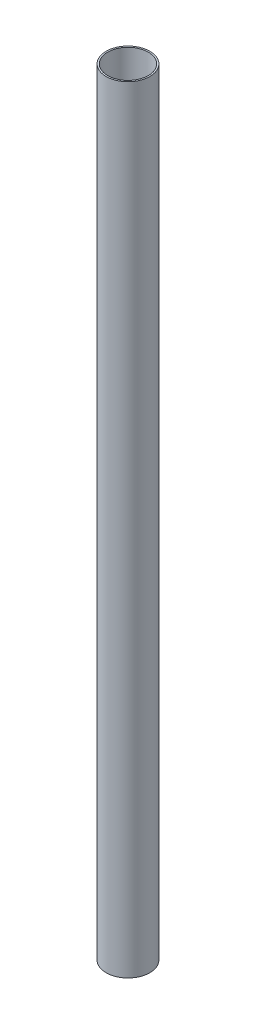
ISO-10303-21;
HEADER;
FILE_DESCRIPTION(('STEP AP214'),'2;1');
FILE_NAME('part.step','',(''),(''),'','','');
FILE_SCHEMA(('AUTOMOTIVE_DESIGN { 1 0 10303 214 1 1 1 1 }'));
ENDSEC;
DATA;
#1=APPLICATION_CONTEXT('core data for automotive mechanical design processes');
#2=APPLICATION_PROTOCOL_DEFINITION('international standard','automotive_design',2000,#1);
#3=PRODUCT_CONTEXT('',#1,'mechanical');
#4=PRODUCT('Part','Part','',(#3));
#5=PRODUCT_RELATED_PRODUCT_CATEGORY('part','',(#4));
#6=PRODUCT_DEFINITION_FORMATION('','',#4);
#7=PRODUCT_DEFINITION_CONTEXT('part definition',#1,'design');
#8=PRODUCT_DEFINITION('design','',#6,#7);
#9=PRODUCT_DEFINITION_SHAPE('','',#8);
#10=(LENGTH_UNIT() NAMED_UNIT(*) SI_UNIT(.MILLI.,.METRE.));
#11=(NAMED_UNIT(*) PLANE_ANGLE_UNIT() SI_UNIT($,.RADIAN.));
#12=(NAMED_UNIT(*) SI_UNIT($,.STERADIAN.) SOLID_ANGLE_UNIT());
#13=UNCERTAINTY_MEASURE_WITH_UNIT(LENGTH_MEASURE(1.E-05),#10,'distance_accuracy_value','');
#14=(GEOMETRIC_REPRESENTATION_CONTEXT(3) GLOBAL_UNCERTAINTY_ASSIGNED_CONTEXT((#13)) GLOBAL_UNIT_ASSIGNED_CONTEXT((#10,
#11,#12)) REPRESENTATION_CONTEXT('',''));
#15=CARTESIAN_POINT('',(0.,0.,0.));
#16=DIRECTION('',(0.,0.,1.));
#17=DIRECTION('',(1.,0.,0.));
#18=AXIS2_PLACEMENT_3D('',#15,#16,#17);
#19=CARTESIAN_POINT('',(0.,534.,0.));
#20=DIRECTION('',(0.,1.,0.));
#21=DIRECTION('',(0.,0.,1.));
#22=AXIS2_PLACEMENT_3D('',#19,#20,#21);
#23=PLANE('',#22);
#24=CARTESIAN_POINT('',(0.,534.,0.));
#25=DIRECTION('',(0.,1.,0.));
#26=DIRECTION('',(0.,0.,1.));
#27=AXIS2_PLACEMENT_3D('',#24,#25,#26);
#28=CIRCLE('',#27,15.0495);
#29=CARTESIAN_POINT('',(0.,534.,15.0495));
#30=VERTEX_POINT('',#29);
#31=EDGE_CURVE('E12',#30,#30,#28,.T.);
#32=ORIENTED_EDGE('',*,*,#31,.T.);
#33=EDGE_LOOP('',(#32));
#34=FACE_BOUND('',#33,.T.);
#35=CARTESIAN_POINT('',(0.,534.,0.));
#36=DIRECTION('',(0.,1.,0.));
#37=DIRECTION('',(0.,0.,1.));
#38=AXIS2_PLACEMENT_3D('',#35,#36,#37);
#39=CIRCLE('',#38,13.9827);
#40=CARTESIAN_POINT('',(0.,534.,13.9827));
#41=VERTEX_POINT('',#40);
#42=EDGE_CURVE('E52',#41,#41,#39,.T.);
#43=ORIENTED_EDGE('',*,*,#42,.F.);
#44=EDGE_LOOP('',(#43));
#45=FACE_BOUND('',#44,.T.);
#46=ADVANCED_FACE('F41',(#34,#45),#23,.T.);
#47=CARTESIAN_POINT('',(0.,0.,0.));
#48=DIRECTION('',(0.,1.,0.));
#49=DIRECTION('',(0.,0.,1.));
#50=AXIS2_PLACEMENT_3D('',#47,#48,#49);
#51=PLANE('',#50);
#52=CARTESIAN_POINT('',(0.,0.,0.));
#53=DIRECTION('',(0.,1.,0.));
#54=DIRECTION('',(0.,0.,1.));
#55=AXIS2_PLACEMENT_3D('',#52,#53,#54);
#56=CIRCLE('',#55,15.0495);
#57=CARTESIAN_POINT('',(0.,0.,15.0495));
#58=VERTEX_POINT('',#57);
#59=EDGE_CURVE('E45',#58,#58,#56,.T.);
#60=ORIENTED_EDGE('',*,*,#59,.F.);
#61=EDGE_LOOP('',(#60));
#62=FACE_BOUND('',#61,.T.);
#63=CARTESIAN_POINT('',(0.,0.,0.));
#64=DIRECTION('',(0.,1.,0.));
#65=DIRECTION('',(0.,0.,1.));
#66=AXIS2_PLACEMENT_3D('',#63,#64,#65);
#67=CIRCLE('',#66,13.9827);
#68=CARTESIAN_POINT('',(0.,0.,13.9827));
#69=VERTEX_POINT('',#68);
#70=EDGE_CURVE('E54',#69,#69,#67,.T.);
#71=ORIENTED_EDGE('',*,*,#70,.T.);
#72=EDGE_LOOP('',(#71));
#73=FACE_BOUND('',#72,.T.);
#74=ADVANCED_FACE('F64',(#62,#73),#51,.F.);
#75=CARTESIAN_POINT('',(0.,534.,0.));
#76=DIRECTION('',(0.,-1.,0.));
#77=DIRECTION('',(0.,0.,-1.));
#78=AXIS2_PLACEMENT_3D('',#75,#76,#77);
#79=CYLINDRICAL_SURFACE('',#78,15.0495);
#80=ORIENTED_EDGE('',*,*,#31,.F.);
#81=EDGE_LOOP('',(#80));
#82=FACE_BOUND('',#81,.T.);
#83=ORIENTED_EDGE('',*,*,#59,.T.);
#84=EDGE_LOOP('',(#83));
#85=FACE_BOUND('',#84,.T.);
#86=ADVANCED_FACE('F43',(#82,#85),#79,.T.);
#87=CARTESIAN_POINT('',(0.,534.,0.));
#88=DIRECTION('',(0.,-1.,0.));
#89=DIRECTION('',(0.,0.,-1.));
#90=AXIS2_PLACEMENT_3D('',#87,#88,#89);
#91=CYLINDRICAL_SURFACE('',#90,13.9827);
#92=ORIENTED_EDGE('',*,*,#42,.T.);
#93=EDGE_LOOP('',(#92));
#94=FACE_BOUND('',#93,.T.);
#95=ORIENTED_EDGE('',*,*,#70,.F.);
#96=EDGE_LOOP('',(#95));
#97=FACE_BOUND('',#96,.T.);
#98=ADVANCED_FACE('F60',(#94,#97),#91,.F.);
#99=CLOSED_SHELL('',(#46,#74,#86,#98));
#100=MANIFOLD_SOLID_BREP('B2',#99);
#101=ADVANCED_BREP_SHAPE_REPRESENTATION('',(#18,#100),#14);
#102=SHAPE_DEFINITION_REPRESENTATION(#9,#101);
ENDSEC;
END-ISO-10303-21;
